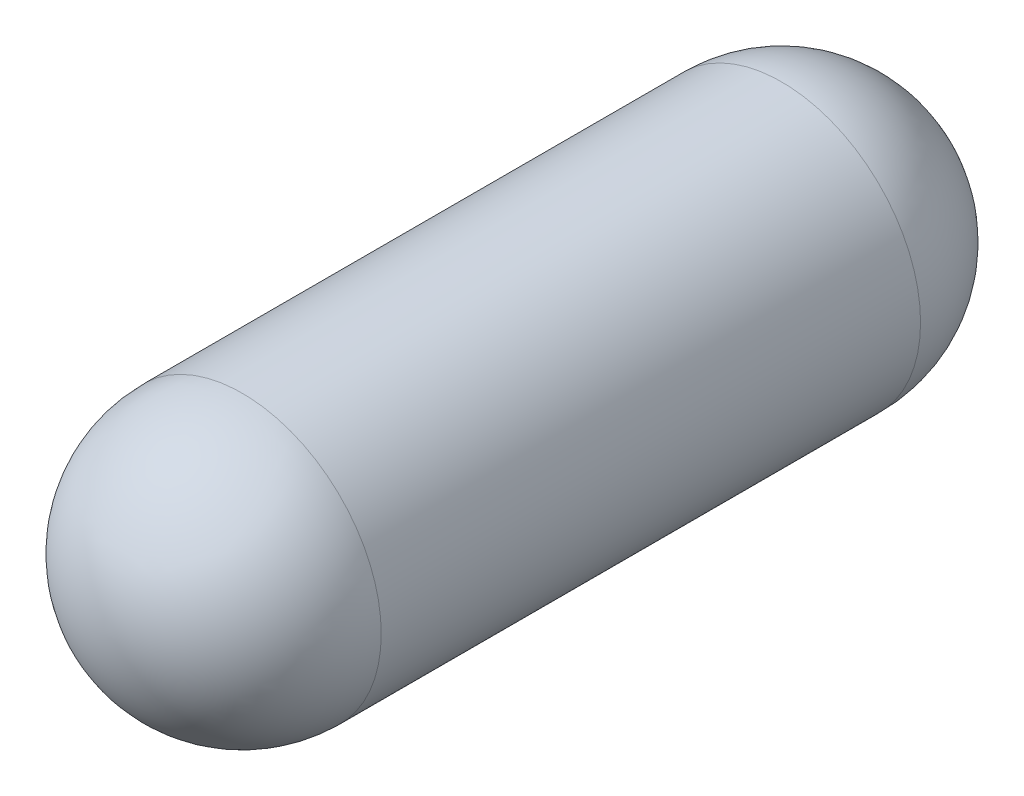
ISO-10303-21;
HEADER;
FILE_DESCRIPTION(('STEP AP214'),'2;1');
FILE_NAME('part.step','',(''),(''),'','','');
FILE_SCHEMA(('AUTOMOTIVE_DESIGN { 1 0 10303 214 1 1 1 1 }'));
ENDSEC;
DATA;
#1=APPLICATION_CONTEXT('core data for automotive mechanical design processes');
#2=APPLICATION_PROTOCOL_DEFINITION('international standard','automotive_design',2000,#1);
#3=PRODUCT_CONTEXT('',#1,'mechanical');
#4=PRODUCT('Part','Part','',(#3));
#5=PRODUCT_RELATED_PRODUCT_CATEGORY('part','',(#4));
#6=PRODUCT_DEFINITION_FORMATION('','',#4);
#7=PRODUCT_DEFINITION_CONTEXT('part definition',#1,'design');
#8=PRODUCT_DEFINITION('design','',#6,#7);
#9=PRODUCT_DEFINITION_SHAPE('','',#8);
#10=(LENGTH_UNIT() NAMED_UNIT(*) SI_UNIT(.MILLI.,.METRE.));
#11=(NAMED_UNIT(*) PLANE_ANGLE_UNIT() SI_UNIT($,.RADIAN.));
#12=(NAMED_UNIT(*) SI_UNIT($,.STERADIAN.) SOLID_ANGLE_UNIT());
#13=UNCERTAINTY_MEASURE_WITH_UNIT(LENGTH_MEASURE(1.E-05),#10,'distance_accuracy_value','');
#14=(GEOMETRIC_REPRESENTATION_CONTEXT(3) GLOBAL_UNCERTAINTY_ASSIGNED_CONTEXT((#13)) GLOBAL_UNIT_ASSIGNED_CONTEXT((#10,
#11,#12)) REPRESENTATION_CONTEXT('',''));
#15=CARTESIAN_POINT('',(0.,0.,0.));
#16=DIRECTION('',(0.,0.,1.));
#17=DIRECTION('',(1.,0.,0.));
#18=AXIS2_PLACEMENT_3D('',#15,#16,#17);
#19=CARTESIAN_POINT('',(0.,0.,-25.));
#20=DIRECTION('',(0.,0.,1.));
#21=DIRECTION('',(1.,0.,0.));
#22=AXIS2_PLACEMENT_3D('',#19,#20,#21);
#23=CYLINDRICAL_SURFACE('',#22,8.5);
#24=CARTESIAN_POINT('',(0.,0.,-16.5));
#25=DIRECTION('',(0.,0.,1.));
#26=DIRECTION('',(1.,0.,0.));
#27=AXIS2_PLACEMENT_3D('',#24,#25,#26);
#28=CIRCLE('',#27,8.5);
#29=CARTESIAN_POINT('',(8.5,0.,-16.5));
#30=VERTEX_POINT('',#29);
#31=EDGE_CURVE('E10',#30,#30,#28,.T.);
#32=ORIENTED_EDGE('',*,*,#31,.T.);
#33=EDGE_LOOP('',(#32));
#34=FACE_BOUND('',#33,.T.);
#35=CARTESIAN_POINT('',(0.,0.,16.5));
#36=DIRECTION('',(0.,0.,1.));
#37=DIRECTION('',(1.,0.,0.));
#38=AXIS2_PLACEMENT_3D('',#35,#36,#37);
#39=CIRCLE('',#38,8.5);
#40=CARTESIAN_POINT('',(8.5,0.,16.5));
#41=VERTEX_POINT('',#40);
#42=EDGE_CURVE('E44',#41,#41,#39,.F.);
#43=ORIENTED_EDGE('',*,*,#42,.T.);
#44=EDGE_LOOP('',(#43));
#45=FACE_BOUND('',#44,.T.);
#46=ADVANCED_FACE('F36',(#34,#45),#23,.T.);
#47=CARTESIAN_POINT('',(0.,0.,-16.5));
#48=DIRECTION('',(0.,0.,1.));
#49=DIRECTION('',(1.,0.,0.));
#50=AXIS2_PLACEMENT_3D('',#47,#48,#49);
#51=SPHERICAL_SURFACE('',#50,8.5);
#52=ORIENTED_EDGE('',*,*,#31,.F.);
#53=EDGE_LOOP('',(#52));
#54=FACE_BOUND('',#53,.T.);
#55=ADVANCED_FACE('F53',(#54),#51,.T.);
#56=CARTESIAN_POINT('',(0.,0.,16.5));
#57=DIRECTION('',(0.,0.,1.));
#58=DIRECTION('',(1.,0.,0.));
#59=AXIS2_PLACEMENT_3D('',#56,#57,#58);
#60=SPHERICAL_SURFACE('',#59,8.5);
#61=ORIENTED_EDGE('',*,*,#42,.F.);
#62=EDGE_LOOP('',(#61));
#63=FACE_BOUND('',#62,.T.);
#64=ADVANCED_FACE('F38',(#63),#60,.T.);
#65=CLOSED_SHELL('',(#46,#55,#64));
#66=MANIFOLD_SOLID_BREP('B2',#65);
#67=ADVANCED_BREP_SHAPE_REPRESENTATION('',(#18,#66),#14);
#68=SHAPE_DEFINITION_REPRESENTATION(#9,#67);
ENDSEC;
END-ISO-10303-21;
